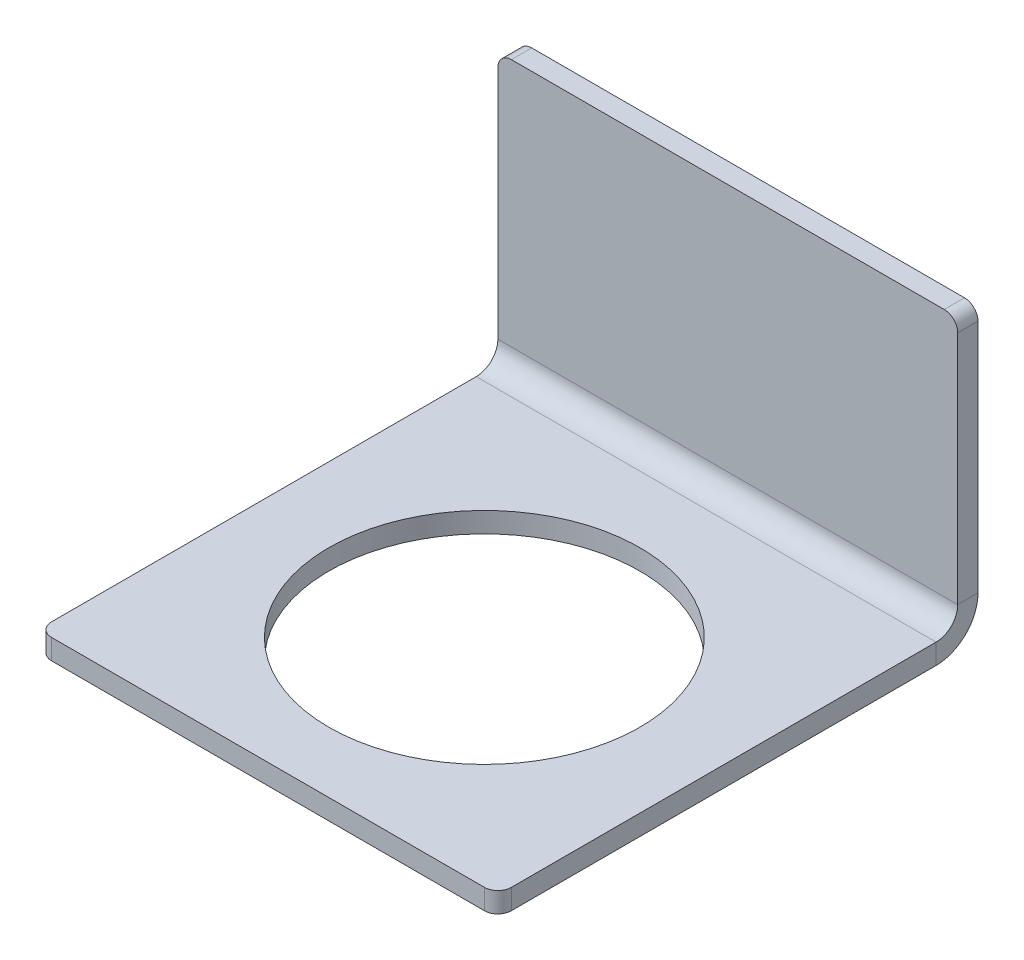
ISO-10303-21;
HEADER;
FILE_DESCRIPTION(('STEP AP214'),'2;1');
FILE_NAME('part.step','',(''),(''),'','','');
FILE_SCHEMA(('AUTOMOTIVE_DESIGN { 1 0 10303 214 1 1 1 1 }'));
ENDSEC;
DATA;
#1=APPLICATION_CONTEXT('core data for automotive mechanical design processes');
#2=APPLICATION_PROTOCOL_DEFINITION('international standard','automotive_design',2000,#1);
#3=PRODUCT_CONTEXT('',#1,'mechanical');
#4=PRODUCT('Part','Part','',(#3));
#5=PRODUCT_RELATED_PRODUCT_CATEGORY('part','',(#4));
#6=PRODUCT_DEFINITION_FORMATION('','',#4);
#7=PRODUCT_DEFINITION_CONTEXT('part definition',#1,'design');
#8=PRODUCT_DEFINITION('design','',#6,#7);
#9=PRODUCT_DEFINITION_SHAPE('','',#8);
#10=(LENGTH_UNIT() NAMED_UNIT(*) SI_UNIT(.MILLI.,.METRE.));
#11=(NAMED_UNIT(*) PLANE_ANGLE_UNIT() SI_UNIT($,.RADIAN.));
#12=(NAMED_UNIT(*) SI_UNIT($,.STERADIAN.) SOLID_ANGLE_UNIT());
#13=UNCERTAINTY_MEASURE_WITH_UNIT(LENGTH_MEASURE(1.E-05),#10,'distance_accuracy_value','');
#14=(GEOMETRIC_REPRESENTATION_CONTEXT(3) GLOBAL_UNCERTAINTY_ASSIGNED_CONTEXT((#13)) GLOBAL_UNIT_ASSIGNED_CONTEXT((#10,
#11,#12)) REPRESENTATION_CONTEXT('',''));
#15=CARTESIAN_POINT('',(0.,0.,0.));
#16=DIRECTION('',(0.,0.,1.));
#17=DIRECTION('',(1.,0.,0.));
#18=AXIS2_PLACEMENT_3D('',#15,#16,#17);
#19=CARTESIAN_POINT('',(17.,1.6,0.));
#20=DIRECTION('',(1.,0.,0.));
#21=DIRECTION('',(0.,0.,-1.));
#22=AXIS2_PLACEMENT_3D('',#19,#20,#21);
#23=PLANE('',#22);
#24=DIRECTION('',(0.,0.,-1.));
#25=VECTOR('',#24,1.);
#26=CARTESIAN_POINT('',(17.,1.6,0.));
#27=LINE('',#26,#25);
#28=CARTESIAN_POINT('',(17.,1.6,0.));
#29=VERTEX_POINT('',#28);
#30=CARTESIAN_POINT('',(17.,1.6,-1.5));
#31=VERTEX_POINT('',#30);
#32=EDGE_CURVE('E129',#29,#31,#27,.T.);
#33=ORIENTED_EDGE('',*,*,#32,.F.);
#34=CARTESIAN_POINT('',(17.,1.6,1.6));
#35=DIRECTION('',(-1.,0.,0.));
#36=DIRECTION('',(0.,0.,1.));
#37=AXIS2_PLACEMENT_3D('',#34,#35,#36);
#38=CIRCLE('',#37,1.6);
#39=CARTESIAN_POINT('',(17.,0.,1.6));
#40=VERTEX_POINT('',#39);
#41=EDGE_CURVE('E133',#40,#29,#38,.F.);
#42=ORIENTED_EDGE('',*,*,#41,.F.);
#43=DIRECTION('',(0.,1.,0.));
#44=VECTOR('',#43,1.);
#45=CARTESIAN_POINT('',(17.,-1.5,1.6));
#46=LINE('',#45,#44);
#47=CARTESIAN_POINT('',(17.,-1.5,1.6));
#48=VERTEX_POINT('',#47);
#49=EDGE_CURVE('E141',#48,#40,#46,.T.);
#50=ORIENTED_EDGE('',*,*,#49,.F.);
#51=CARTESIAN_POINT('',(17.,1.6,1.6));
#52=DIRECTION('',(1.,0.,0.));
#53=DIRECTION('',(0.,0.,-1.));
#54=AXIS2_PLACEMENT_3D('',#51,#52,#53);
#55=CIRCLE('',#54,3.1);
#56=EDGE_CURVE('E135',#48,#31,#55,.T.);
#57=ORIENTED_EDGE('',*,*,#56,.T.);
#58=EDGE_LOOP('',(#33,#42,#50,#57));
#59=FACE_BOUND('',#58,.T.);
#60=ADVANCED_FACE('F38',(#59),#23,.T.);
#61=CARTESIAN_POINT('',(17.,-1.5,1.6));
#62=DIRECTION('',(1.,0.,0.));
#63=DIRECTION('',(0.,0.,-1.));
#64=AXIS2_PLACEMENT_3D('',#61,#62,#63);
#65=PLANE('',#64);
#66=DIRECTION('',(0.,1.,0.));
#67=VECTOR('',#66,1.);
#68=CARTESIAN_POINT('',(17.,0.,-1.5));
#69=LINE('',#68,#67);
#70=CARTESIAN_POINT('',(17.,19.,-1.5));
#71=VERTEX_POINT('',#70);
#72=EDGE_CURVE('E163',#31,#71,#69,.T.);
#73=ORIENTED_EDGE('',*,*,#72,.T.);
#74=DIRECTION('',(0.,0.,-1.));
#75=VECTOR('',#74,1.);
#76=CARTESIAN_POINT('',(17.,19.,1.6));
#77=LINE('',#76,#75);
#78=CARTESIAN_POINT('',(17.,19.,0.));
#79=VERTEX_POINT('',#78);
#80=EDGE_CURVE('E162',#71,#79,#77,.F.);
#81=ORIENTED_EDGE('',*,*,#80,.T.);
#82=DIRECTION('',(0.,1.,0.));
#83=VECTOR('',#82,1.);
#84=CARTESIAN_POINT('',(17.,0.,0.));
#85=LINE('',#84,#83);
#86=EDGE_CURVE('E150',#29,#79,#85,.T.);
#87=ORIENTED_EDGE('',*,*,#86,.F.);
#88=ORIENTED_EDGE('',*,*,#32,.T.);
#89=EDGE_LOOP('',(#73,#81,#87,#88));
#90=FACE_BOUND('',#89,.T.);
#91=ADVANCED_FACE('F160',(#90),#65,.T.);
#92=CARTESIAN_POINT('',(-17.,0.,1.6));
#93=DIRECTION('',(-1.,0.,0.));
#94=DIRECTION('',(0.,0.,1.));
#95=AXIS2_PLACEMENT_3D('',#92,#93,#94);
#96=PLANE('',#95);
#97=DIRECTION('',(0.,-1.,0.));
#98=VECTOR('',#97,1.);
#99=CARTESIAN_POINT('',(-17.,0.,1.6));
#100=LINE('',#99,#98);
#101=CARTESIAN_POINT('',(-17.,0.,1.6));
#102=VERTEX_POINT('',#101);
#103=CARTESIAN_POINT('',(-17.,-1.5,1.6));
#104=VERTEX_POINT('',#103);
#105=EDGE_CURVE('E208',#102,#104,#100,.T.);
#106=ORIENTED_EDGE('',*,*,#105,.F.);
#107=CARTESIAN_POINT('',(-17.,1.6,1.6));
#108=DIRECTION('',(-1.,0.,0.));
#109=DIRECTION('',(0.,0.,1.));
#110=AXIS2_PLACEMENT_3D('',#107,#108,#109);
#111=CIRCLE('',#110,1.6);
#112=CARTESIAN_POINT('',(-17.,1.6,0.));
#113=VERTEX_POINT('',#112);
#114=EDGE_CURVE('E182',#102,#113,#111,.F.);
#115=ORIENTED_EDGE('',*,*,#114,.T.);
#116=DIRECTION('',(0.,0.,1.));
#117=VECTOR('',#116,1.);
#118=CARTESIAN_POINT('',(-17.,1.6,-1.5));
#119=LINE('',#118,#117);
#120=CARTESIAN_POINT('',(-17.,1.6,-1.5));
#121=VERTEX_POINT('',#120);
#122=EDGE_CURVE('E206',#121,#113,#119,.T.);
#123=ORIENTED_EDGE('',*,*,#122,.F.);
#124=CARTESIAN_POINT('',(-17.,1.6,1.6));
#125=DIRECTION('',(1.,0.,0.));
#126=DIRECTION('',(0.,0.,-1.));
#127=AXIS2_PLACEMENT_3D('',#124,#125,#126);
#128=CIRCLE('',#127,3.1);
#129=EDGE_CURVE('E188',#104,#121,#128,.T.);
#130=ORIENTED_EDGE('',*,*,#129,.F.);
#131=EDGE_LOOP('',(#106,#115,#123,#130));
#132=FACE_BOUND('',#131,.T.);
#133=ADVANCED_FACE('F290',(#132),#96,.T.);
#134=CARTESIAN_POINT('',(-17.,1.6,-1.5));
#135=DIRECTION('',(-1.,0.,0.));
#136=DIRECTION('',(0.,0.,1.));
#137=AXIS2_PLACEMENT_3D('',#134,#135,#136);
#138=PLANE('',#137);
#139=DIRECTION('',(0.,0.,-1.));
#140=VECTOR('',#139,1.);
#141=CARTESIAN_POINT('',(-17.,-1.5,34.));
#142=LINE('',#141,#140);
#143=CARTESIAN_POINT('',(-17.,-1.5,33.));
#144=VERTEX_POINT('',#143);
#145=EDGE_CURVE('E186',#144,#104,#142,.T.);
#146=ORIENTED_EDGE('',*,*,#145,.F.);
#147=DIRECTION('',(0.,1.,0.));
#148=VECTOR('',#147,1.);
#149=CARTESIAN_POINT('',(-17.,1.6,33.));
#150=LINE('',#149,#148);
#151=CARTESIAN_POINT('',(-17.,0.,33.));
#152=VERTEX_POINT('',#151);
#153=EDGE_CURVE('E11',#144,#152,#150,.T.);
#154=ORIENTED_EDGE('',*,*,#153,.T.);
#155=DIRECTION('',(0.,0.,-1.));
#156=VECTOR('',#155,1.);
#157=CARTESIAN_POINT('',(-17.,0.,34.));
#158=LINE('',#157,#156);
#159=EDGE_CURVE('E184',#152,#102,#158,.T.);
#160=ORIENTED_EDGE('',*,*,#159,.T.);
#161=ORIENTED_EDGE('',*,*,#105,.T.);
#162=EDGE_LOOP('',(#146,#154,#160,#161));
#163=FACE_BOUND('',#162,.T.);
#164=ADVANCED_FACE('F310',(#163),#138,.T.);
#165=CARTESIAN_POINT('',(17.,0.,-1.5));
#166=DIRECTION('',(0.,0.,1.));
#167=DIRECTION('',(1.,0.,0.));
#168=AXIS2_PLACEMENT_3D('',#165,#166,#167);
#169=PLANE('',#168);
#170=DIRECTION('',(0.,1.,0.));
#171=VECTOR('',#170,1.);
#172=CARTESIAN_POINT('',(-17.,0.,-1.5));
#173=LINE('',#172,#171);
#174=CARTESIAN_POINT('',(-17.,19.,-1.5));
#175=VERTEX_POINT('',#174);
#176=EDGE_CURVE('E177',#121,#175,#173,.T.);
#177=ORIENTED_EDGE('',*,*,#176,.T.);
#178=CARTESIAN_POINT('',(-16.,19.,-1.5));
#179=DIRECTION('',(0.,0.,1.));
#180=DIRECTION('',(1.,0.,0.));
#181=AXIS2_PLACEMENT_3D('',#178,#179,#180);
#182=CIRCLE('',#181,1.);
#183=CARTESIAN_POINT('',(-16.,20.,-1.5));
#184=VERTEX_POINT('',#183);
#185=EDGE_CURVE('E217',#175,#184,#182,.F.);
#186=ORIENTED_EDGE('',*,*,#185,.T.);
#187=DIRECTION('',(-1.,0.,0.));
#188=VECTOR('',#187,1.);
#189=CARTESIAN_POINT('',(17.,20.,-1.5));
#190=LINE('',#189,#188);
#191=CARTESIAN_POINT('',(16.,20.,-1.5));
#192=VERTEX_POINT('',#191);
#193=EDGE_CURVE('E203',#192,#184,#190,.T.);
#194=ORIENTED_EDGE('',*,*,#193,.F.);
#195=CARTESIAN_POINT('',(16.,19.,-1.5));
#196=DIRECTION('',(0.,0.,1.));
#197=DIRECTION('',(1.,0.,0.));
#198=AXIS2_PLACEMENT_3D('',#195,#196,#197);
#199=CIRCLE('',#198,1.);
#200=EDGE_CURVE('E215',#192,#71,#199,.F.);
#201=ORIENTED_EDGE('',*,*,#200,.T.);
#202=ORIENTED_EDGE('',*,*,#72,.F.);
#203=DIRECTION('',(-1.,0.,0.));
#204=VECTOR('',#203,1.);
#205=CARTESIAN_POINT('',(17.,1.6,-1.5));
#206=LINE('',#205,#204);
#207=EDGE_CURVE('E176',#31,#121,#206,.T.);
#208=ORIENTED_EDGE('',*,*,#207,.T.);
#209=EDGE_LOOP('',(#177,#186,#194,#201,#202,#208));
#210=FACE_BOUND('',#209,.T.);
#211=ADVANCED_FACE('F259',(#210),#169,.F.);
#212=CARTESIAN_POINT('',(17.,20.,0.));
#213=DIRECTION('',(0.,1.,0.));
#214=DIRECTION('',(0.,0.,1.));
#215=AXIS2_PLACEMENT_3D('',#212,#213,#214);
#216=PLANE('',#215);
#217=ORIENTED_EDGE('',*,*,#193,.T.);
#218=DIRECTION('',(0.,0.,-1.));
#219=VECTOR('',#218,1.);
#220=CARTESIAN_POINT('',(-16.,20.,0.));
#221=LINE('',#220,#219);
#222=CARTESIAN_POINT('',(-16.,20.,0.));
#223=VERTEX_POINT('',#222);
#224=EDGE_CURVE('E222',#184,#223,#221,.F.);
#225=ORIENTED_EDGE('',*,*,#224,.T.);
#226=DIRECTION('',(-1.,0.,0.));
#227=VECTOR('',#226,1.);
#228=CARTESIAN_POINT('',(17.,20.,0.));
#229=LINE('',#228,#227);
#230=CARTESIAN_POINT('',(16.,20.,0.));
#231=VERTEX_POINT('',#230);
#232=EDGE_CURVE('E157',#231,#223,#229,.T.);
#233=ORIENTED_EDGE('',*,*,#232,.F.);
#234=DIRECTION('',(0.,0.,-1.));
#235=VECTOR('',#234,1.);
#236=CARTESIAN_POINT('',(16.,20.,0.));
#237=LINE('',#236,#235);
#238=EDGE_CURVE('E219',#231,#192,#237,.T.);
#239=ORIENTED_EDGE('',*,*,#238,.T.);
#240=EDGE_LOOP('',(#217,#225,#233,#239));
#241=FACE_BOUND('',#240,.T.);
#242=ADVANCED_FACE('F317',(#241),#216,.T.);
#243=CARTESIAN_POINT('',(17.,0.,0.));
#244=DIRECTION('',(0.,0.,1.));
#245=DIRECTION('',(1.,0.,0.));
#246=AXIS2_PLACEMENT_3D('',#243,#244,#245);
#247=PLANE('',#246);
#248=ORIENTED_EDGE('',*,*,#232,.T.);
#249=CARTESIAN_POINT('',(-16.,19.,0.));
#250=DIRECTION('',(0.,0.,1.));
#251=DIRECTION('',(1.,0.,0.));
#252=AXIS2_PLACEMENT_3D('',#249,#250,#251);
#253=CIRCLE('',#252,1.);
#254=CARTESIAN_POINT('',(-17.,19.,0.));
#255=VERTEX_POINT('',#254);
#256=EDGE_CURVE('E226',#223,#255,#253,.T.);
#257=ORIENTED_EDGE('',*,*,#256,.T.);
#258=DIRECTION('',(0.,1.,0.));
#259=VECTOR('',#258,1.);
#260=CARTESIAN_POINT('',(-17.,0.,0.));
#261=LINE('',#260,#259);
#262=EDGE_CURVE('E153',#113,#255,#261,.T.);
#263=ORIENTED_EDGE('',*,*,#262,.F.);
#264=DIRECTION('',(-1.,0.,0.));
#265=VECTOR('',#264,1.);
#266=CARTESIAN_POINT('',(17.,1.6,0.));
#267=LINE('',#266,#265);
#268=EDGE_CURVE('E147',#29,#113,#267,.T.);
#269=ORIENTED_EDGE('',*,*,#268,.F.);
#270=ORIENTED_EDGE('',*,*,#86,.T.);
#271=CARTESIAN_POINT('',(16.,19.,0.));
#272=DIRECTION('',(0.,0.,1.));
#273=DIRECTION('',(1.,0.,0.));
#274=AXIS2_PLACEMENT_3D('',#271,#272,#273);
#275=CIRCLE('',#274,1.);
#276=EDGE_CURVE('E224',#79,#231,#275,.T.);
#277=ORIENTED_EDGE('',*,*,#276,.T.);
#278=EDGE_LOOP('',(#248,#257,#263,#269,#270,#277));
#279=FACE_BOUND('',#278,.T.);
#280=ADVANCED_FACE('F149',(#279),#247,.T.);
#281=CARTESIAN_POINT('',(17.,1.6,1.6));
#282=DIRECTION('',(-1.,0.,0.));
#283=DIRECTION('',(0.,0.,1.));
#284=AXIS2_PLACEMENT_3D('',#281,#282,#283);
#285=CYLINDRICAL_SURFACE('',#284,1.6);
#286=ORIENTED_EDGE('',*,*,#114,.F.);
#287=DIRECTION('',(-1.,0.,0.));
#288=VECTOR('',#287,1.);
#289=CARTESIAN_POINT('',(17.,0.,1.6));
#290=LINE('',#289,#288);
#291=EDGE_CURVE('E158',#40,#102,#290,.T.);
#292=ORIENTED_EDGE('',*,*,#291,.F.);
#293=ORIENTED_EDGE('',*,*,#41,.T.);
#294=ORIENTED_EDGE('',*,*,#268,.T.);
#295=EDGE_LOOP('',(#286,#292,#293,#294));
#296=FACE_BOUND('',#295,.T.);
#297=ADVANCED_FACE('F166',(#296),#285,.F.);
#298=CARTESIAN_POINT('',(17.,0.,34.));
#299=DIRECTION('',(0.,1.,0.));
#300=DIRECTION('',(0.,0.,1.));
#301=AXIS2_PLACEMENT_3D('',#298,#299,#300);
#302=PLANE('',#301);
#303=CARTESIAN_POINT('',(0.,0.,18.));
#304=DIRECTION('',(0.,1.,0.));
#305=DIRECTION('',(0.,0.,1.));
#306=AXIS2_PLACEMENT_3D('',#303,#304,#305);
#307=CIRCLE('',#306,11.5);
#308=CARTESIAN_POINT('',(0.,0.,29.5));
#309=VERTEX_POINT('',#308);
#310=EDGE_CURVE('E262',#309,#309,#307,.T.);
#311=ORIENTED_EDGE('',*,*,#310,.F.);
#312=EDGE_LOOP('',(#311));
#313=FACE_BOUND('',#312,.T.);
#314=DIRECTION('',(-1.,0.,0.));
#315=VECTOR('',#314,1.);
#316=CARTESIAN_POINT('',(17.,0.,34.));
#317=LINE('',#316,#315);
#318=CARTESIAN_POINT('',(16.,0.,34.));
#319=VERTEX_POINT('',#318);
#320=CARTESIAN_POINT('',(-16.,0.,34.));
#321=VERTEX_POINT('',#320);
#322=EDGE_CURVE('E198',#319,#321,#317,.T.);
#323=ORIENTED_EDGE('',*,*,#322,.F.);
#324=CARTESIAN_POINT('',(16.,0.,33.));
#325=DIRECTION('',(0.,1.,0.));
#326=DIRECTION('',(0.,0.,1.));
#327=AXIS2_PLACEMENT_3D('',#324,#325,#326);
#328=CIRCLE('',#327,1.);
#329=CARTESIAN_POINT('',(17.,0.,33.));
#330=VERTEX_POINT('',#329);
#331=EDGE_CURVE('E236',#319,#330,#328,.T.);
#332=ORIENTED_EDGE('',*,*,#331,.T.);
#333=DIRECTION('',(0.,0.,-1.));
#334=VECTOR('',#333,1.);
#335=CARTESIAN_POINT('',(17.,0.,34.));
#336=LINE('',#335,#334);
#337=EDGE_CURVE('E168',#330,#40,#336,.T.);
#338=ORIENTED_EDGE('',*,*,#337,.T.);
#339=ORIENTED_EDGE('',*,*,#291,.T.);
#340=ORIENTED_EDGE('',*,*,#159,.F.);
#341=CARTESIAN_POINT('',(-16.,0.,33.));
#342=DIRECTION('',(0.,1.,0.));
#343=DIRECTION('',(0.,0.,1.));
#344=AXIS2_PLACEMENT_3D('',#341,#342,#343);
#345=CIRCLE('',#344,1.);
#346=EDGE_CURVE('E234',#152,#321,#345,.T.);
#347=ORIENTED_EDGE('',*,*,#346,.T.);
#348=EDGE_LOOP('',(#323,#332,#338,#339,#340,#347));
#349=FACE_BOUND('',#348,.T.);
#350=ADVANCED_FACE('F251',(#313,#349),#302,.T.);
#351=CARTESIAN_POINT('',(17.,-1.5,34.));
#352=DIRECTION('',(0.,0.,1.));
#353=DIRECTION('',(1.,0.,0.));
#354=AXIS2_PLACEMENT_3D('',#351,#352,#353);
#355=PLANE('',#354);
#356=DIRECTION('',(-1.,0.,0.));
#357=VECTOR('',#356,1.);
#358=CARTESIAN_POINT('',(17.,-1.5,34.));
#359=LINE('',#358,#357);
#360=CARTESIAN_POINT('',(16.,-1.5,34.));
#361=VERTEX_POINT('',#360);
#362=CARTESIAN_POINT('',(-16.,-1.5,34.));
#363=VERTEX_POINT('',#362);
#364=EDGE_CURVE('E196',#361,#363,#359,.T.);
#365=ORIENTED_EDGE('',*,*,#364,.F.);
#366=DIRECTION('',(0.,1.,0.));
#367=VECTOR('',#366,1.);
#368=CARTESIAN_POINT('',(16.,0.,34.));
#369=LINE('',#368,#367);
#370=EDGE_CURVE('E231',#361,#319,#369,.T.);
#371=ORIENTED_EDGE('',*,*,#370,.T.);
#372=ORIENTED_EDGE('',*,*,#322,.T.);
#373=DIRECTION('',(0.,1.,0.));
#374=VECTOR('',#373,1.);
#375=CARTESIAN_POINT('',(-16.,-1.5,34.));
#376=LINE('',#375,#374);
#377=EDGE_CURVE('E229',#321,#363,#376,.F.);
#378=ORIENTED_EDGE('',*,*,#377,.T.);
#379=EDGE_LOOP('',(#365,#371,#372,#378));
#380=FACE_BOUND('',#379,.T.);
#381=ADVANCED_FACE('F246',(#380),#355,.T.);
#382=CARTESIAN_POINT('',(17.,-1.5,34.));
#383=DIRECTION('',(0.,1.,0.));
#384=DIRECTION('',(0.,0.,1.));
#385=AXIS2_PLACEMENT_3D('',#382,#383,#384);
#386=PLANE('',#385);
#387=CARTESIAN_POINT('',(0.,-1.5,18.));
#388=DIRECTION('',(0.,1.,0.));
#389=DIRECTION('',(0.,0.,1.));
#390=AXIS2_PLACEMENT_3D('',#387,#388,#389);
#391=CIRCLE('',#390,11.5);
#392=CARTESIAN_POINT('',(0.,-1.5,29.5));
#393=VERTEX_POINT('',#392);
#394=EDGE_CURVE('E180',#393,#393,#391,.T.);
#395=ORIENTED_EDGE('',*,*,#394,.T.);
#396=EDGE_LOOP('',(#395));
#397=FACE_BOUND('',#396,.T.);
#398=DIRECTION('',(0.,0.,-1.));
#399=VECTOR('',#398,1.);
#400=CARTESIAN_POINT('',(17.,-1.5,34.));
#401=LINE('',#400,#399);
#402=CARTESIAN_POINT('',(17.,-1.5,33.));
#403=VERTEX_POINT('',#402);
#404=EDGE_CURVE('E170',#403,#48,#401,.T.);
#405=ORIENTED_EDGE('',*,*,#404,.F.);
#406=CARTESIAN_POINT('',(16.,-1.5,33.));
#407=DIRECTION('',(0.,1.,0.));
#408=DIRECTION('',(0.,0.,1.));
#409=AXIS2_PLACEMENT_3D('',#406,#407,#408);
#410=CIRCLE('',#409,1.);
#411=EDGE_CURVE('E46',#403,#361,#410,.F.);
#412=ORIENTED_EDGE('',*,*,#411,.T.);
#413=ORIENTED_EDGE('',*,*,#364,.T.);
#414=CARTESIAN_POINT('',(-16.,-1.5,33.));
#415=DIRECTION('',(0.,1.,0.));
#416=DIRECTION('',(0.,0.,1.));
#417=AXIS2_PLACEMENT_3D('',#414,#415,#416);
#418=CIRCLE('',#417,1.);
#419=EDGE_CURVE('E53',#363,#144,#418,.F.);
#420=ORIENTED_EDGE('',*,*,#419,.T.);
#421=ORIENTED_EDGE('',*,*,#145,.T.);
#422=DIRECTION('',(-1.,0.,0.));
#423=VECTOR('',#422,1.);
#424=CARTESIAN_POINT('',(17.,-1.5,1.6));
#425=LINE('',#424,#423);
#426=EDGE_CURVE('E193',#48,#104,#425,.T.);
#427=ORIENTED_EDGE('',*,*,#426,.F.);
#428=EDGE_LOOP('',(#405,#412,#413,#420,#421,#427));
#429=FACE_BOUND('',#428,.T.);
#430=ADVANCED_FACE('F241',(#397,#429),#386,.F.);
#431=CARTESIAN_POINT('',(17.,1.6,1.6));
#432=DIRECTION('',(-1.,0.,0.));
#433=DIRECTION('',(0.,0.,1.));
#434=AXIS2_PLACEMENT_3D('',#431,#432,#433);
#435=CYLINDRICAL_SURFACE('',#434,3.1);
#436=ORIENTED_EDGE('',*,*,#129,.T.);
#437=ORIENTED_EDGE('',*,*,#207,.F.);
#438=ORIENTED_EDGE('',*,*,#56,.F.);
#439=ORIENTED_EDGE('',*,*,#426,.T.);
#440=EDGE_LOOP('',(#436,#437,#438,#439));
#441=FACE_BOUND('',#440,.T.);
#442=ADVANCED_FACE('F255',(#441),#435,.T.);
#443=CARTESIAN_POINT('',(17.,1.6,1.6));
#444=DIRECTION('',(-1.,0.,0.));
#445=DIRECTION('',(0.,0.,1.));
#446=AXIS2_PLACEMENT_3D('',#443,#444,#445);
#447=PLANE('',#446);
#448=ORIENTED_EDGE('',*,*,#337,.F.);
#449=DIRECTION('',(0.,1.,0.));
#450=VECTOR('',#449,1.);
#451=CARTESIAN_POINT('',(17.,-1.5,33.));
#452=LINE('',#451,#450);
#453=EDGE_CURVE('E61',#330,#403,#452,.F.);
#454=ORIENTED_EDGE('',*,*,#453,.T.);
#455=ORIENTED_EDGE('',*,*,#404,.T.);
#456=ORIENTED_EDGE('',*,*,#49,.T.);
#457=EDGE_LOOP('',(#448,#454,#455,#456));
#458=FACE_BOUND('',#457,.T.);
#459=ADVANCED_FACE('F252',(#458),#447,.F.);
#460=CARTESIAN_POINT('',(-17.,1.6,1.6));
#461=DIRECTION('',(-1.,0.,0.));
#462=DIRECTION('',(0.,0.,1.));
#463=AXIS2_PLACEMENT_3D('',#460,#461,#462);
#464=PLANE('',#463);
#465=ORIENTED_EDGE('',*,*,#262,.T.);
#466=DIRECTION('',(0.,0.,-1.));
#467=VECTOR('',#466,1.);
#468=CARTESIAN_POINT('',(-17.,19.,1.6));
#469=LINE('',#468,#467);
#470=EDGE_CURVE('E140',#255,#175,#469,.T.);
#471=ORIENTED_EDGE('',*,*,#470,.T.);
#472=ORIENTED_EDGE('',*,*,#176,.F.);
#473=ORIENTED_EDGE('',*,*,#122,.T.);
#474=EDGE_LOOP('',(#465,#471,#472,#473));
#475=FACE_BOUND('',#474,.T.);
#476=ADVANCED_FACE('F273',(#475),#464,.T.);
#477=CARTESIAN_POINT('',(0.,-1.5,18.));
#478=DIRECTION('',(0.,1.,0.));
#479=DIRECTION('',(0.,0.,1.));
#480=AXIS2_PLACEMENT_3D('',#477,#478,#479);
#481=CYLINDRICAL_SURFACE('',#480,11.5);
#482=CARTESIAN_POINT('',(0.,-1.5,29.5));
#483=CARTESIAN_POINT('',(0.,-1.484375,29.5));
#484=CARTESIAN_POINT('',(0.,-1.46875,29.5));
#485=CARTESIAN_POINT('',(0.,-1.4375,29.5));
#486=CARTESIAN_POINT('',(0.,-1.421875,29.5));
#487=CARTESIAN_POINT('',(0.,-1.390625,29.5));
#488=CARTESIAN_POINT('',(0.,-1.375,29.5));
#489=CARTESIAN_POINT('',(0.,-1.34375,29.5));
#490=CARTESIAN_POINT('',(0.,-1.328125,29.5));
#491=CARTESIAN_POINT('',(0.,-1.296875,29.5));
#492=CARTESIAN_POINT('',(0.,-1.28125,29.5));
#493=CARTESIAN_POINT('',(0.,-1.25,29.5));
#494=CARTESIAN_POINT('',(0.,-1.234375,29.5));
#495=CARTESIAN_POINT('',(0.,-1.203125,29.5));
#496=CARTESIAN_POINT('',(0.,-1.1875,29.5));
#497=CARTESIAN_POINT('',(0.,-1.15625,29.5));
#498=CARTESIAN_POINT('',(0.,-1.140625,29.5));
#499=CARTESIAN_POINT('',(0.,-1.109375,29.5));
#500=CARTESIAN_POINT('',(0.,-1.09375,29.5));
#501=CARTESIAN_POINT('',(0.,-1.0625,29.5));
#502=CARTESIAN_POINT('',(0.,-1.046875,29.5));
#503=CARTESIAN_POINT('',(0.,-1.015625,29.5));
#504=CARTESIAN_POINT('',(0.,-1.,29.5));
#505=CARTESIAN_POINT('',(0.,-0.96875,29.5));
#506=CARTESIAN_POINT('',(0.,-0.953125,29.5));
#507=CARTESIAN_POINT('',(0.,-0.921875,29.5));
#508=CARTESIAN_POINT('',(0.,-0.90625,29.5));
#509=CARTESIAN_POINT('',(0.,-0.875,29.5));
#510=CARTESIAN_POINT('',(0.,-0.859375,29.5));
#511=CARTESIAN_POINT('',(0.,-0.828125,29.5));
#512=CARTESIAN_POINT('',(0.,-0.8125,29.5));
#513=CARTESIAN_POINT('',(0.,-0.78125,29.5));
#514=CARTESIAN_POINT('',(0.,-0.765625,29.5));
#515=CARTESIAN_POINT('',(0.,-0.734375,29.5));
#516=CARTESIAN_POINT('',(0.,-0.71875,29.5));
#517=CARTESIAN_POINT('',(0.,-0.6875,29.5));
#518=CARTESIAN_POINT('',(0.,-0.671875,29.5));
#519=CARTESIAN_POINT('',(0.,-0.640625,29.5));
#520=CARTESIAN_POINT('',(0.,-0.625,29.5));
#521=CARTESIAN_POINT('',(0.,-0.59375,29.5));
#522=CARTESIAN_POINT('',(0.,-0.578125,29.5));
#523=CARTESIAN_POINT('',(0.,-0.546875,29.5));
#524=CARTESIAN_POINT('',(0.,-0.53125,29.5));
#525=CARTESIAN_POINT('',(0.,-0.5,29.5));
#526=CARTESIAN_POINT('',(0.,-0.484375,29.5));
#527=CARTESIAN_POINT('',(0.,-0.453125,29.5));
#528=CARTESIAN_POINT('',(0.,-0.4375,29.5));
#529=CARTESIAN_POINT('',(0.,-0.40625,29.5));
#530=CARTESIAN_POINT('',(0.,-0.390625,29.5));
#531=CARTESIAN_POINT('',(0.,-0.359375,29.5));
#532=CARTESIAN_POINT('',(0.,-0.34375,29.5));
#533=CARTESIAN_POINT('',(0.,-0.3125,29.5));
#534=CARTESIAN_POINT('',(0.,-0.296875,29.5));
#535=CARTESIAN_POINT('',(0.,-0.265625,29.5));
#536=CARTESIAN_POINT('',(0.,-0.25,29.5));
#537=CARTESIAN_POINT('',(0.,-0.21875,29.5));
#538=CARTESIAN_POINT('',(0.,-0.203125,29.5));
#539=CARTESIAN_POINT('',(0.,-0.171875,29.5));
#540=CARTESIAN_POINT('',(0.,-0.15625,29.5));
#541=CARTESIAN_POINT('',(0.,-0.125,29.5));
#542=CARTESIAN_POINT('',(0.,-0.109375,29.5));
#543=CARTESIAN_POINT('',(0.,-0.0781250000000001,29.5));
#544=CARTESIAN_POINT('',(0.,-0.0625000000000001,29.5));
#545=CARTESIAN_POINT('',(0.,-0.03125,29.5));
#546=CARTESIAN_POINT('',(0.,-0.015625,29.5));
#547=CARTESIAN_POINT('',(0.,0.,29.5));
#548=B_SPLINE_CURVE_WITH_KNOTS('',3,(#482,#483,#484,#485,#486,#487,#488,#489,#490,#491,#492,
#493,#494,#495,#496,#497,#498,#499,#500,#501,#502,#503,#504,#505,#506,#507,#508,#509,#510,#511,
#512,#513,#514,#515,#516,#517,#518,#519,#520,#521,#522,#523,#524,#525,#526,#527,#528,#529,#530,
#531,#532,#533,#534,#535,#536,#537,#538,#539,#540,#541,#542,#543,#544,#545,#546,#547),
.UNSPECIFIED.,.F.,.F.,(4,2,2,2,2,2,2,2,2,2,2,2,2,2,2,2,2,2,2,2,2,2,2,2,2,2,2,2,2,2,2,2,4),(0.,
0.046875,0.0937500000000001,0.140625,0.1875,0.234375,0.28125,0.328125,0.375,0.421875,0.46875,
0.515625,0.5625,0.609375,0.65625,0.703125,0.75,0.796875,0.84375,0.890625,0.9375,0.984375,
1.03125,1.078125,1.125,1.171875,1.21875,1.265625,1.3125,1.359375,1.40625,1.453125,1.5),.UNSPECIFIED.);
#549=EDGE_CURVE('BSEAM269',#393,#309,#548,.T.);
#550=ORIENTED_EDGE('',*,*,#394,.F.);
#551=ORIENTED_EDGE('',*,*,#310,.T.);
#552=ORIENTED_EDGE('',*,*,#549,.T.);
#553=ORIENTED_EDGE('',*,*,#549,.F.);
#554=EDGE_LOOP('',(#550,#552,#551,#553));
#555=FACE_BOUND('',#554,.T.);
#556=ADVANCED_FACE('F269',(#555),#481,.F.);
#557=CARTESIAN_POINT('',(-16.,19.,1.6));
#558=DIRECTION('',(0.,0.,-1.));
#559=DIRECTION('',(-1.,0.,0.));
#560=AXIS2_PLACEMENT_3D('',#557,#558,#559);
#561=CYLINDRICAL_SURFACE('',#560,1.);
#562=ORIENTED_EDGE('',*,*,#256,.F.);
#563=ORIENTED_EDGE('',*,*,#224,.F.);
#564=ORIENTED_EDGE('',*,*,#185,.F.);
#565=ORIENTED_EDGE('',*,*,#470,.F.);
#566=EDGE_LOOP('',(#562,#563,#564,#565));
#567=FACE_BOUND('',#566,.T.);
#568=ADVANCED_FACE('F272',(#567),#561,.T.);
#569=CARTESIAN_POINT('',(16.,19.,0.));
#570=DIRECTION('',(0.,0.,-1.));
#571=DIRECTION('',(-1.,0.,0.));
#572=AXIS2_PLACEMENT_3D('',#569,#570,#571);
#573=CYLINDRICAL_SURFACE('',#572,1.);
#574=ORIENTED_EDGE('',*,*,#276,.F.);
#575=ORIENTED_EDGE('',*,*,#80,.F.);
#576=ORIENTED_EDGE('',*,*,#200,.F.);
#577=ORIENTED_EDGE('',*,*,#238,.F.);
#578=EDGE_LOOP('',(#574,#575,#576,#577));
#579=FACE_BOUND('',#578,.T.);
#580=ADVANCED_FACE('F296',(#579),#573,.T.);
#581=CARTESIAN_POINT('',(16.,-1.5,33.));
#582=DIRECTION('',(0.,-1.,0.));
#583=DIRECTION('',(0.,0.,-1.));
#584=AXIS2_PLACEMENT_3D('',#581,#582,#583);
#585=CYLINDRICAL_SURFACE('',#584,1.);
#586=ORIENTED_EDGE('',*,*,#411,.F.);
#587=ORIENTED_EDGE('',*,*,#453,.F.);
#588=ORIENTED_EDGE('',*,*,#331,.F.);
#589=ORIENTED_EDGE('',*,*,#370,.F.);
#590=EDGE_LOOP('',(#586,#587,#588,#589));
#591=FACE_BOUND('',#590,.T.);
#592=ADVANCED_FACE('F249',(#591),#585,.T.);
#593=CARTESIAN_POINT('',(-16.,1.6,33.));
#594=DIRECTION('',(0.,1.,0.));
#595=DIRECTION('',(0.,0.,1.));
#596=AXIS2_PLACEMENT_3D('',#593,#594,#595);
#597=CYLINDRICAL_SURFACE('',#596,1.);
#598=ORIENTED_EDGE('',*,*,#419,.F.);
#599=ORIENTED_EDGE('',*,*,#377,.F.);
#600=ORIENTED_EDGE('',*,*,#346,.F.);
#601=ORIENTED_EDGE('',*,*,#153,.F.);
#602=EDGE_LOOP('',(#598,#599,#600,#601));
#603=FACE_BOUND('',#602,.T.);
#604=ADVANCED_FACE('F40',(#603),#597,.T.);
#605=CLOSED_SHELL('',(#60,#91,#133,#164,#211,#242,#280,#297,#350,#381,#430,#442,#459,#476,#556,
#568,#580,#592,#604));
#606=MANIFOLD_SOLID_BREP('B2',#605);
#607=ADVANCED_BREP_SHAPE_REPRESENTATION('',(#18,#606),#14);
#608=SHAPE_DEFINITION_REPRESENTATION(#9,#607);
ENDSEC;
END-ISO-10303-21;
